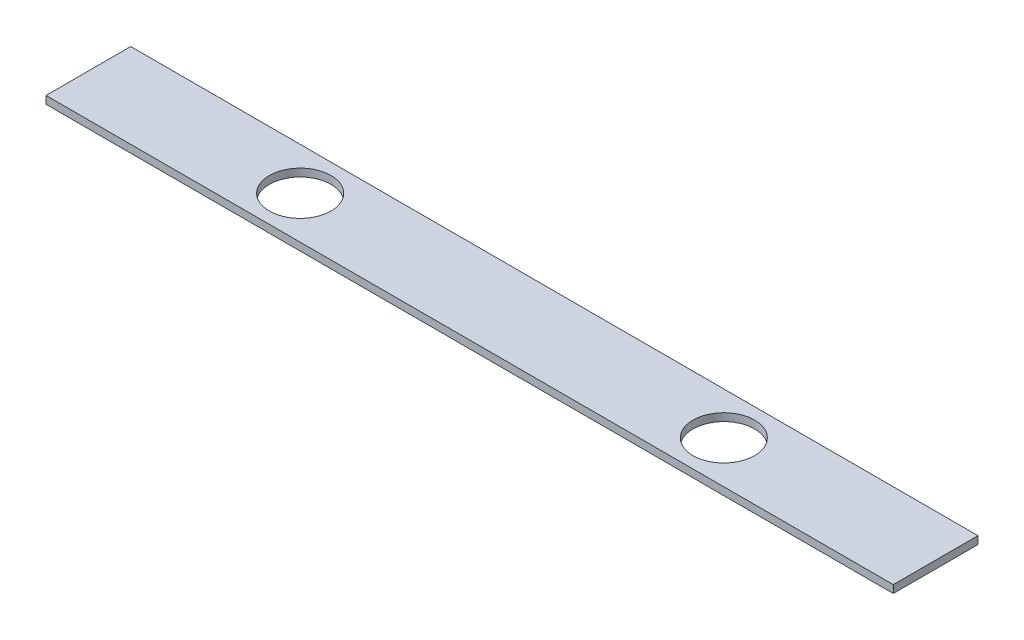
ISO-10303-21;
HEADER;
FILE_DESCRIPTION(('STEP AP214'),'2;1');
FILE_NAME('part.step','',(''),(''),'','','');
FILE_SCHEMA(('AUTOMOTIVE_DESIGN { 1 0 10303 214 1 1 1 1 }'));
ENDSEC;
DATA;
#1=APPLICATION_CONTEXT('core data for automotive mechanical design processes');
#2=APPLICATION_PROTOCOL_DEFINITION('international standard','automotive_design',2000,#1);
#3=PRODUCT_CONTEXT('',#1,'mechanical');
#4=PRODUCT('Part','Part','',(#3));
#5=PRODUCT_RELATED_PRODUCT_CATEGORY('part','',(#4));
#6=PRODUCT_DEFINITION_FORMATION('','',#4);
#7=PRODUCT_DEFINITION_CONTEXT('part definition',#1,'design');
#8=PRODUCT_DEFINITION('design','',#6,#7);
#9=PRODUCT_DEFINITION_SHAPE('','',#8);
#10=(LENGTH_UNIT() NAMED_UNIT(*) SI_UNIT(.MILLI.,.METRE.));
#11=(NAMED_UNIT(*) PLANE_ANGLE_UNIT() SI_UNIT($,.RADIAN.));
#12=(NAMED_UNIT(*) SI_UNIT($,.STERADIAN.) SOLID_ANGLE_UNIT());
#13=UNCERTAINTY_MEASURE_WITH_UNIT(LENGTH_MEASURE(1.E-05),#10,'distance_accuracy_value','');
#14=(GEOMETRIC_REPRESENTATION_CONTEXT(3) GLOBAL_UNCERTAINTY_ASSIGNED_CONTEXT((#13)) GLOBAL_UNIT_ASSIGNED_CONTEXT((#10,
#11,#12)) REPRESENTATION_CONTEXT('',''));
#15=CARTESIAN_POINT('',(0.,0.,0.));
#16=DIRECTION('',(0.,0.,1.));
#17=DIRECTION('',(1.,0.,0.));
#18=AXIS2_PLACEMENT_3D('',#15,#16,#17);
#19=CARTESIAN_POINT('',(0.,2.,0.));
#20=DIRECTION('',(0.,-1.,0.));
#21=DIRECTION('',(0.,0.,-1.));
#22=AXIS2_PLACEMENT_3D('',#19,#20,#21);
#23=PLANE('',#22);
#24=DIRECTION('',(0.,0.,1.));
#25=VECTOR('',#24,1.);
#26=CARTESIAN_POINT('',(0.,2.,0.));
#27=LINE('',#26,#25);
#28=CARTESIAN_POINT('',(0.,2.,-22.));
#29=VERTEX_POINT('',#28);
#30=CARTESIAN_POINT('',(0.,2.,0.));
#31=VERTEX_POINT('',#30);
#32=EDGE_CURVE('E92',#29,#31,#27,.T.);
#33=ORIENTED_EDGE('',*,*,#32,.T.);
#34=DIRECTION('',(1.,0.,0.));
#35=VECTOR('',#34,1.);
#36=CARTESIAN_POINT('',(0.,2.,0.));
#37=LINE('',#36,#35);
#38=CARTESIAN_POINT('',(220.,2.,0.));
#39=VERTEX_POINT('',#38);
#40=EDGE_CURVE('E87',#31,#39,#37,.T.);
#41=ORIENTED_EDGE('',*,*,#40,.T.);
#42=DIRECTION('',(0.,0.,-1.));
#43=VECTOR('',#42,1.);
#44=CARTESIAN_POINT('',(220.,2.,0.));
#45=LINE('',#44,#43);
#46=CARTESIAN_POINT('',(220.,2.,-22.));
#47=VERTEX_POINT('',#46);
#48=EDGE_CURVE('E90',#39,#47,#45,.T.);
#49=ORIENTED_EDGE('',*,*,#48,.T.);
#50=DIRECTION('',(-1.,0.,0.));
#51=VECTOR('',#50,1.);
#52=CARTESIAN_POINT('',(0.,2.,-22.));
#53=LINE('',#52,#51);
#54=EDGE_CURVE('E57',#47,#29,#53,.T.);
#55=ORIENTED_EDGE('',*,*,#54,.T.);
#56=EDGE_LOOP('',(#33,#41,#49,#55));
#57=FACE_BOUND('',#56,.T.);
#58=CARTESIAN_POINT('',(165.,2.,-11.));
#59=DIRECTION('',(0.,1.,0.));
#60=DIRECTION('',(0.,0.,1.));
#61=AXIS2_PLACEMENT_3D('',#58,#59,#60);
#62=CIRCLE('',#61,8.00000000000001);
#63=CARTESIAN_POINT('',(165.,2.,-2.99999999999999));
#64=VERTEX_POINT('',#63);
#65=EDGE_CURVE('E112',#64,#64,#62,.T.);
#66=ORIENTED_EDGE('',*,*,#65,.F.);
#67=EDGE_LOOP('',(#66));
#68=FACE_BOUND('',#67,.T.);
#69=CARTESIAN_POINT('',(55.,2.,-11.));
#70=DIRECTION('',(0.,1.,0.));
#71=DIRECTION('',(0.,0.,1.));
#72=AXIS2_PLACEMENT_3D('',#69,#70,#71);
#73=CIRCLE('',#72,8.00000000000001);
#74=CARTESIAN_POINT('',(55.,2.,-2.99999999999999));
#75=VERTEX_POINT('',#74);
#76=EDGE_CURVE('E134',#75,#75,#73,.T.);
#77=ORIENTED_EDGE('',*,*,#76,.F.);
#78=EDGE_LOOP('',(#77));
#79=FACE_BOUND('',#78,.T.);
#80=ADVANCED_FACE('F39',(#57,#68,#79),#23,.F.);
#81=CARTESIAN_POINT('',(0.,0.,0.));
#82=DIRECTION('',(0.,-1.,0.));
#83=DIRECTION('',(0.,0.,-1.));
#84=AXIS2_PLACEMENT_3D('',#81,#82,#83);
#85=PLANE('',#84);
#86=CARTESIAN_POINT('',(165.,0.,-11.));
#87=DIRECTION('',(0.,1.,0.));
#88=DIRECTION('',(0.,0.,1.));
#89=AXIS2_PLACEMENT_3D('',#86,#87,#88);
#90=CIRCLE('',#89,8.00000000000001);
#91=CARTESIAN_POINT('',(165.,0.,-2.99999999999999));
#92=VERTEX_POINT('',#91);
#93=EDGE_CURVE('E130',#92,#92,#90,.T.);
#94=ORIENTED_EDGE('',*,*,#93,.T.);
#95=EDGE_LOOP('',(#94));
#96=FACE_BOUND('',#95,.T.);
#97=DIRECTION('',(0.,0.,1.));
#98=VECTOR('',#97,1.);
#99=CARTESIAN_POINT('',(0.,0.,0.));
#100=LINE('',#99,#98);
#101=CARTESIAN_POINT('',(0.,0.,-22.));
#102=VERTEX_POINT('',#101);
#103=CARTESIAN_POINT('',(0.,0.,0.));
#104=VERTEX_POINT('',#103);
#105=EDGE_CURVE('E108',#102,#104,#100,.T.);
#106=ORIENTED_EDGE('',*,*,#105,.F.);
#107=DIRECTION('',(-1.,0.,0.));
#108=VECTOR('',#107,1.);
#109=CARTESIAN_POINT('',(0.,0.,-22.));
#110=LINE('',#109,#108);
#111=CARTESIAN_POINT('',(220.,0.,-22.));
#112=VERTEX_POINT('',#111);
#113=EDGE_CURVE('E80',#112,#102,#110,.T.);
#114=ORIENTED_EDGE('',*,*,#113,.F.);
#115=DIRECTION('',(0.,0.,-1.));
#116=VECTOR('',#115,1.);
#117=CARTESIAN_POINT('',(220.,0.,0.));
#118=LINE('',#117,#116);
#119=CARTESIAN_POINT('',(220.,0.,0.));
#120=VERTEX_POINT('',#119);
#121=EDGE_CURVE('E74',#120,#112,#118,.T.);
#122=ORIENTED_EDGE('',*,*,#121,.F.);
#123=DIRECTION('',(1.,0.,0.));
#124=VECTOR('',#123,1.);
#125=CARTESIAN_POINT('',(0.,0.,0.));
#126=LINE('',#125,#124);
#127=EDGE_CURVE('E97',#104,#120,#126,.T.);
#128=ORIENTED_EDGE('',*,*,#127,.F.);
#129=EDGE_LOOP('',(#106,#114,#122,#128));
#130=FACE_BOUND('',#129,.T.);
#131=CARTESIAN_POINT('',(55.,0.,-11.));
#132=DIRECTION('',(0.,1.,0.));
#133=DIRECTION('',(0.,0.,1.));
#134=AXIS2_PLACEMENT_3D('',#131,#132,#133);
#135=CIRCLE('',#134,8.00000000000001);
#136=CARTESIAN_POINT('',(55.,0.,-2.99999999999999));
#137=VERTEX_POINT('',#136);
#138=EDGE_CURVE('E138',#137,#137,#135,.T.);
#139=ORIENTED_EDGE('',*,*,#138,.T.);
#140=EDGE_LOOP('',(#139));
#141=FACE_BOUND('',#140,.T.);
#142=ADVANCED_FACE('F125',(#96,#130,#141),#85,.T.);
#143=CARTESIAN_POINT('',(0.,2.,0.));
#144=DIRECTION('',(1.,0.,0.));
#145=DIRECTION('',(0.,0.,-1.));
#146=AXIS2_PLACEMENT_3D('',#143,#144,#145);
#147=PLANE('',#146);
#148=ORIENTED_EDGE('',*,*,#105,.T.);
#149=DIRECTION('',(0.,-1.,0.));
#150=VECTOR('',#149,1.);
#151=CARTESIAN_POINT('',(0.,2.,0.));
#152=LINE('',#151,#150);
#153=EDGE_CURVE('E11',#31,#104,#152,.T.);
#154=ORIENTED_EDGE('',*,*,#153,.F.);
#155=ORIENTED_EDGE('',*,*,#32,.F.);
#156=DIRECTION('',(0.,-1.,0.));
#157=VECTOR('',#156,1.);
#158=CARTESIAN_POINT('',(0.,2.,-22.));
#159=LINE('',#158,#157);
#160=EDGE_CURVE('E104',#29,#102,#159,.T.);
#161=ORIENTED_EDGE('',*,*,#160,.T.);
#162=EDGE_LOOP('',(#148,#154,#155,#161));
#163=FACE_BOUND('',#162,.T.);
#164=ADVANCED_FACE('F41',(#163),#147,.F.);
#165=CARTESIAN_POINT('',(0.,2.,0.));
#166=DIRECTION('',(0.,0.,-1.));
#167=DIRECTION('',(-1.,0.,0.));
#168=AXIS2_PLACEMENT_3D('',#165,#166,#167);
#169=PLANE('',#168);
#170=ORIENTED_EDGE('',*,*,#127,.T.);
#171=DIRECTION('',(0.,-1.,0.));
#172=VECTOR('',#171,1.);
#173=CARTESIAN_POINT('',(220.,2.,0.));
#174=LINE('',#173,#172);
#175=EDGE_CURVE('E49',#39,#120,#174,.T.);
#176=ORIENTED_EDGE('',*,*,#175,.F.);
#177=ORIENTED_EDGE('',*,*,#40,.F.);
#178=ORIENTED_EDGE('',*,*,#153,.T.);
#179=EDGE_LOOP('',(#170,#176,#177,#178));
#180=FACE_BOUND('',#179,.T.);
#181=ADVANCED_FACE('F96',(#180),#169,.F.);
#182=CARTESIAN_POINT('',(220.,2.,0.));
#183=DIRECTION('',(-1.,0.,0.));
#184=DIRECTION('',(0.,0.,1.));
#185=AXIS2_PLACEMENT_3D('',#182,#183,#184);
#186=PLANE('',#185);
#187=ORIENTED_EDGE('',*,*,#121,.T.);
#188=DIRECTION('',(0.,-1.,0.));
#189=VECTOR('',#188,1.);
#190=CARTESIAN_POINT('',(220.,2.,-22.));
#191=LINE('',#190,#189);
#192=EDGE_CURVE('E99',#47,#112,#191,.T.);
#193=ORIENTED_EDGE('',*,*,#192,.F.);
#194=ORIENTED_EDGE('',*,*,#48,.F.);
#195=ORIENTED_EDGE('',*,*,#175,.T.);
#196=EDGE_LOOP('',(#187,#193,#194,#195));
#197=FACE_BOUND('',#196,.T.);
#198=ADVANCED_FACE('F100',(#197),#186,.F.);
#199=CARTESIAN_POINT('',(0.,2.,-22.));
#200=DIRECTION('',(0.,0.,1.));
#201=DIRECTION('',(1.,0.,0.));
#202=AXIS2_PLACEMENT_3D('',#199,#200,#201);
#203=PLANE('',#202);
#204=ORIENTED_EDGE('',*,*,#113,.T.);
#205=ORIENTED_EDGE('',*,*,#160,.F.);
#206=ORIENTED_EDGE('',*,*,#54,.F.);
#207=ORIENTED_EDGE('',*,*,#192,.T.);
#208=EDGE_LOOP('',(#204,#205,#206,#207));
#209=FACE_BOUND('',#208,.T.);
#210=ADVANCED_FACE('F122',(#209),#203,.F.);
#211=CARTESIAN_POINT('',(165.,2.,-11.));
#212=DIRECTION('',(0.,-1.,0.));
#213=DIRECTION('',(0.,0.,-1.));
#214=AXIS2_PLACEMENT_3D('',#211,#212,#213);
#215=CYLINDRICAL_SURFACE('',#214,8.00000000000001);
#216=ORIENTED_EDGE('',*,*,#65,.T.);
#217=EDGE_LOOP('',(#216));
#218=FACE_BOUND('',#217,.T.);
#219=ORIENTED_EDGE('',*,*,#93,.F.);
#220=EDGE_LOOP('',(#219));
#221=FACE_BOUND('',#220,.T.);
#222=ADVANCED_FACE('F157',(#218,#221),#215,.F.);
#223=CARTESIAN_POINT('',(55.,2.,-11.));
#224=DIRECTION('',(0.,-1.,0.));
#225=DIRECTION('',(0.,0.,-1.));
#226=AXIS2_PLACEMENT_3D('',#223,#224,#225);
#227=CYLINDRICAL_SURFACE('',#226,8.00000000000001);
#228=ORIENTED_EDGE('',*,*,#76,.T.);
#229=EDGE_LOOP('',(#228));
#230=FACE_BOUND('',#229,.T.);
#231=ORIENTED_EDGE('',*,*,#138,.F.);
#232=EDGE_LOOP('',(#231));
#233=FACE_BOUND('',#232,.T.);
#234=ADVANCED_FACE('F146',(#230,#233),#227,.F.);
#235=CLOSED_SHELL('',(#80,#142,#164,#181,#198,#210,#222,#234));
#236=MANIFOLD_SOLID_BREP('B2',#235);
#237=ADVANCED_BREP_SHAPE_REPRESENTATION('',(#18,#236),#14);
#238=SHAPE_DEFINITION_REPRESENTATION(#9,#237);
ENDSEC;
END-ISO-10303-21;
